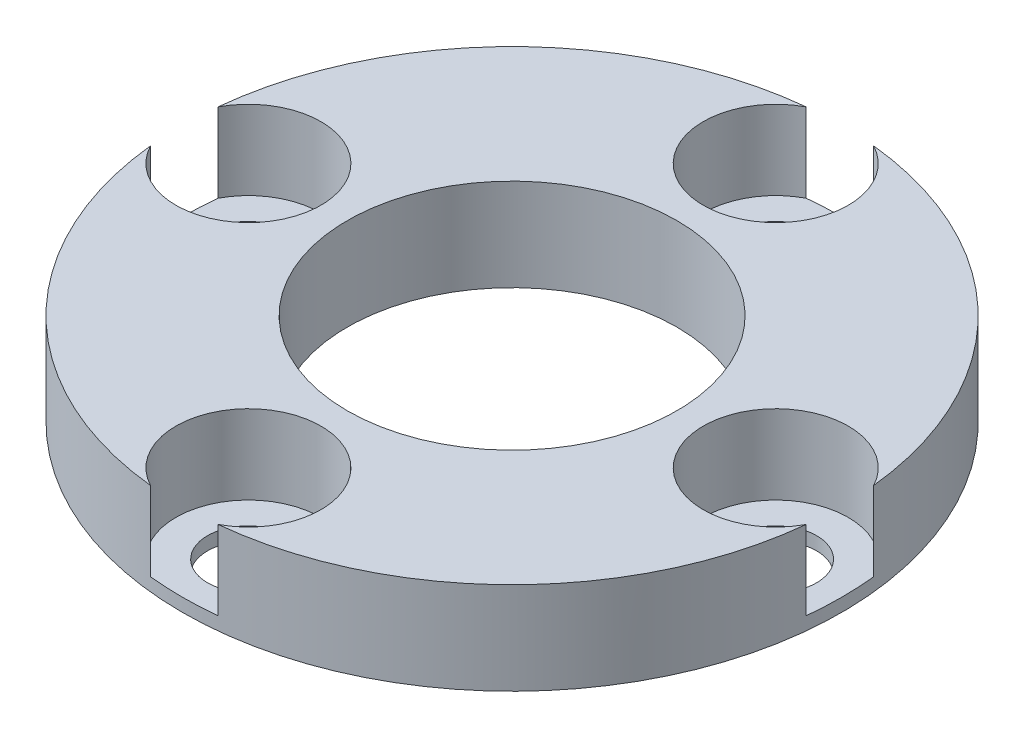
ISO-10303-21;
HEADER;
FILE_DESCRIPTION(('STEP AP214'),'2;1');
FILE_NAME('part.step','',(''),(''),'','','');
FILE_SCHEMA(('AUTOMOTIVE_DESIGN { 1 0 10303 214 1 1 1 1 }'));
ENDSEC;
DATA;
#1=APPLICATION_CONTEXT('core data for automotive mechanical design processes');
#2=APPLICATION_PROTOCOL_DEFINITION('international standard','automotive_design',2000,#1);
#3=PRODUCT_CONTEXT('',#1,'mechanical');
#4=PRODUCT('Part','Part','',(#3));
#5=PRODUCT_RELATED_PRODUCT_CATEGORY('part','',(#4));
#6=PRODUCT_DEFINITION_FORMATION('','',#4);
#7=PRODUCT_DEFINITION_CONTEXT('part definition',#1,'design');
#8=PRODUCT_DEFINITION('design','',#6,#7);
#9=PRODUCT_DEFINITION_SHAPE('','',#8);
#10=(LENGTH_UNIT() NAMED_UNIT(*) SI_UNIT(.MILLI.,.METRE.));
#11=(NAMED_UNIT(*) PLANE_ANGLE_UNIT() SI_UNIT($,.RADIAN.));
#12=(NAMED_UNIT(*) SI_UNIT($,.STERADIAN.) SOLID_ANGLE_UNIT());
#13=UNCERTAINTY_MEASURE_WITH_UNIT(LENGTH_MEASURE(1.E-05),#10,'distance_accuracy_value','');
#14=(GEOMETRIC_REPRESENTATION_CONTEXT(3) GLOBAL_UNCERTAINTY_ASSIGNED_CONTEXT((#13)) GLOBAL_UNIT_ASSIGNED_CONTEXT((#10,
#11,#12)) REPRESENTATION_CONTEXT('',''));
#15=CARTESIAN_POINT('',(0.,0.,0.));
#16=DIRECTION('',(0.,0.,1.));
#17=DIRECTION('',(1.,0.,0.));
#18=AXIS2_PLACEMENT_3D('',#15,#16,#17);
#19=CARTESIAN_POINT('',(-1.04744440165294E-13,-6.5,10.));
#20=DIRECTION('',(0.,1.,0.));
#21=DIRECTION('',(0.,0.,1.));
#22=AXIS2_PLACEMENT_3D('',#19,#20,#21);
#23=CYLINDRICAL_SURFACE('',#22,1.55);
#24=CARTESIAN_POINT('',(-1.04744440165294E-13,0.,10.));
#25=DIRECTION('',(0.,1.,0.));
#26=DIRECTION('',(0.,0.,1.));
#27=AXIS2_PLACEMENT_3D('',#24,#25,#26);
#28=CIRCLE('',#27,1.55);
#29=CARTESIAN_POINT('',(-1.04744440165294E-13,0.,11.55));
#30=VERTEX_POINT('',#29);
#31=EDGE_CURVE('E148',#30,#30,#28,.T.);
#32=ORIENTED_EDGE('',*,*,#31,.F.);
#33=EDGE_LOOP('',(#32));
#34=FACE_BOUND('',#33,.T.);
#35=CARTESIAN_POINT('',(-1.04744440165294E-13,0.5,10.));
#36=DIRECTION('',(0.,1.,0.));
#37=DIRECTION('',(0.,0.,1.));
#38=AXIS2_PLACEMENT_3D('',#35,#36,#37);
#39=CIRCLE('',#38,1.55);
#40=CARTESIAN_POINT('',(-1.04744440165294E-13,0.5,11.55));
#41=VERTEX_POINT('',#40);
#42=EDGE_CURVE('E179',#41,#41,#39,.F.);
#43=ORIENTED_EDGE('',*,*,#42,.F.);
#44=EDGE_LOOP('',(#43));
#45=FACE_BOUND('',#44,.T.);
#46=ADVANCED_FACE('F43',(#34,#45),#23,.F.);
#47=CARTESIAN_POINT('',(10.,-6.5,0.));
#48=DIRECTION('',(0.,1.,0.));
#49=DIRECTION('',(0.,0.,1.));
#50=AXIS2_PLACEMENT_3D('',#47,#48,#49);
#51=CYLINDRICAL_SURFACE('',#50,1.55);
#52=CARTESIAN_POINT('',(10.,0.,0.));
#53=DIRECTION('',(0.,1.,0.));
#54=DIRECTION('',(0.,0.,1.));
#55=AXIS2_PLACEMENT_3D('',#52,#53,#54);
#56=CIRCLE('',#55,1.55);
#57=CARTESIAN_POINT('',(10.,0.,1.55000000000007));
#58=VERTEX_POINT('',#57);
#59=EDGE_CURVE('E152',#58,#58,#56,.T.);
#60=ORIENTED_EDGE('',*,*,#59,.F.);
#61=EDGE_LOOP('',(#60));
#62=FACE_BOUND('',#61,.T.);
#63=CARTESIAN_POINT('',(10.,0.5,0.));
#64=DIRECTION('',(0.,1.,0.));
#65=DIRECTION('',(0.,0.,1.));
#66=AXIS2_PLACEMENT_3D('',#63,#64,#65);
#67=CIRCLE('',#66,1.55);
#68=CARTESIAN_POINT('',(10.,0.5,1.55000000000007));
#69=VERTEX_POINT('',#68);
#70=EDGE_CURVE('E174',#69,#69,#67,.F.);
#71=ORIENTED_EDGE('',*,*,#70,.F.);
#72=EDGE_LOOP('',(#71));
#73=FACE_BOUND('',#72,.T.);
#74=ADVANCED_FACE('F262',(#62,#73),#51,.F.);
#75=CARTESIAN_POINT('',(0.,-6.5,-10.));
#76=DIRECTION('',(0.,1.,0.));
#77=DIRECTION('',(0.,0.,1.));
#78=AXIS2_PLACEMENT_3D('',#75,#76,#77);
#79=CYLINDRICAL_SURFACE('',#78,1.55);
#80=CARTESIAN_POINT('',(0.,0.,-10.));
#81=DIRECTION('',(0.,1.,0.));
#82=DIRECTION('',(0.,0.,1.));
#83=AXIS2_PLACEMENT_3D('',#80,#81,#82);
#84=CIRCLE('',#83,1.55);
#85=CARTESIAN_POINT('',(0.,0.,-8.45));
#86=VERTEX_POINT('',#85);
#87=EDGE_CURVE('E157',#86,#86,#84,.T.);
#88=ORIENTED_EDGE('',*,*,#87,.F.);
#89=EDGE_LOOP('',(#88));
#90=FACE_BOUND('',#89,.T.);
#91=CARTESIAN_POINT('',(0.,0.5,-10.));
#92=DIRECTION('',(0.,1.,0.));
#93=DIRECTION('',(0.,0.,1.));
#94=AXIS2_PLACEMENT_3D('',#91,#92,#93);
#95=CIRCLE('',#94,1.55);
#96=CARTESIAN_POINT('',(0.,0.5,-8.45));
#97=VERTEX_POINT('',#96);
#98=EDGE_CURVE('E169',#97,#97,#95,.F.);
#99=ORIENTED_EDGE('',*,*,#98,.F.);
#100=EDGE_LOOP('',(#99));
#101=FACE_BOUND('',#100,.T.);
#102=ADVANCED_FACE('F267',(#90,#101),#79,.F.);
#103=CARTESIAN_POINT('',(-10.,-6.5,0.));
#104=DIRECTION('',(0.,1.,0.));
#105=DIRECTION('',(0.,0.,1.));
#106=AXIS2_PLACEMENT_3D('',#103,#104,#105);
#107=CYLINDRICAL_SURFACE('',#106,1.55);
#108=CARTESIAN_POINT('',(-10.,0.,0.));
#109=DIRECTION('',(0.,1.,0.));
#110=DIRECTION('',(0.,0.,1.));
#111=AXIS2_PLACEMENT_3D('',#108,#109,#110);
#112=CIRCLE('',#111,1.55);
#113=CARTESIAN_POINT('',(-10.,0.,1.55));
#114=VERTEX_POINT('',#113);
#115=EDGE_CURVE('E161',#114,#114,#112,.T.);
#116=ORIENTED_EDGE('',*,*,#115,.F.);
#117=EDGE_LOOP('',(#116));
#118=FACE_BOUND('',#117,.T.);
#119=CARTESIAN_POINT('',(-10.,0.5,0.));
#120=DIRECTION('',(0.,1.,0.));
#121=DIRECTION('',(0.,0.,1.));
#122=AXIS2_PLACEMENT_3D('',#119,#120,#121);
#123=CIRCLE('',#122,1.55);
#124=CARTESIAN_POINT('',(-10.,0.5,1.55));
#125=VERTEX_POINT('',#124);
#126=EDGE_CURVE('E165',#125,#125,#123,.F.);
#127=ORIENTED_EDGE('',*,*,#126,.F.);
#128=EDGE_LOOP('',(#127));
#129=FACE_BOUND('',#128,.T.);
#130=ADVANCED_FACE('F275',(#118,#129),#107,.F.);
#131=CARTESIAN_POINT('',(0.,3.5,0.));
#132=DIRECTION('',(0.,1.,0.));
#133=DIRECTION('',(0.,0.,1.));
#134=AXIS2_PLACEMENT_3D('',#131,#132,#133);
#135=PLANE('',#134);
#136=CARTESIAN_POINT('',(-10.,3.5,0.));
#137=DIRECTION('',(0.,1.,0.));
#138=DIRECTION('',(0.,0.,1.));
#139=AXIS2_PLACEMENT_3D('',#136,#137,#138);
#140=CIRCLE('',#139,2.75);
#141=CARTESIAN_POINT('',(-12.434375,3.5,1.27918660068615));
#142=VERTEX_POINT('',#141);
#143=CARTESIAN_POINT('',(-12.434375,3.5,-1.27918660068615));
#144=VERTEX_POINT('',#143);
#145=EDGE_CURVE('E108',#142,#144,#140,.T.);
#146=ORIENTED_EDGE('',*,*,#145,.F.);
#147=CARTESIAN_POINT('',(0.,3.5,0.));
#148=DIRECTION('',(0.,1.,0.));
#149=DIRECTION('',(0.,0.,1.));
#150=AXIS2_PLACEMENT_3D('',#147,#148,#149);
#151=CIRCLE('',#150,12.5);
#152=CARTESIAN_POINT('',(-1.27918660068628,3.5,12.434375));
#153=VERTEX_POINT('',#152);
#154=EDGE_CURVE('E131',#142,#153,#151,.T.);
#155=ORIENTED_EDGE('',*,*,#154,.T.);
#156=CARTESIAN_POINT('',(-1.04744440165294E-13,3.5,10.));
#157=DIRECTION('',(0.,1.,0.));
#158=DIRECTION('',(0.,0.,1.));
#159=AXIS2_PLACEMENT_3D('',#156,#157,#158);
#160=CIRCLE('',#159,2.75);
#161=CARTESIAN_POINT('',(1.27918660068602,3.5,12.434375));
#162=VERTEX_POINT('',#161);
#163=EDGE_CURVE('E208',#162,#153,#160,.T.);
#164=ORIENTED_EDGE('',*,*,#163,.F.);
#165=CARTESIAN_POINT('',(12.434375,3.5,1.27918660068624));
#166=VERTEX_POINT('',#165);
#167=EDGE_CURVE('E135',#162,#166,#151,.T.);
#168=ORIENTED_EDGE('',*,*,#167,.T.);
#169=CARTESIAN_POINT('',(10.,3.5,0.));
#170=DIRECTION('',(0.,1.,0.));
#171=DIRECTION('',(0.,0.,1.));
#172=AXIS2_PLACEMENT_3D('',#169,#170,#171);
#173=CIRCLE('',#172,2.75);
#174=CARTESIAN_POINT('',(12.434375,3.5,-1.27918660068606));
#175=VERTEX_POINT('',#174);
#176=EDGE_CURVE('E221',#175,#166,#173,.T.);
#177=ORIENTED_EDGE('',*,*,#176,.F.);
#178=CARTESIAN_POINT('',(1.27918660068619,3.5,-12.434375));
#179=VERTEX_POINT('',#178);
#180=EDGE_CURVE('E130',#175,#179,#151,.T.);
#181=ORIENTED_EDGE('',*,*,#180,.T.);
#182=CARTESIAN_POINT('',(0.,3.5,-10.));
#183=DIRECTION('',(0.,1.,0.));
#184=DIRECTION('',(0.,0.,1.));
#185=AXIS2_PLACEMENT_3D('',#182,#183,#184);
#186=CIRCLE('',#185,2.75);
#187=CARTESIAN_POINT('',(-1.27918660068611,3.5,-12.434375));
#188=VERTEX_POINT('',#187);
#189=EDGE_CURVE('E117',#188,#179,#186,.T.);
#190=ORIENTED_EDGE('',*,*,#189,.F.);
#191=EDGE_CURVE('E123',#188,#144,#151,.T.);
#192=ORIENTED_EDGE('',*,*,#191,.T.);
#193=EDGE_LOOP('',(#146,#155,#164,#168,#177,#181,#190,#192));
#194=FACE_BOUND('',#193,.T.);
#195=CARTESIAN_POINT('',(0.,3.5,0.));
#196=DIRECTION('',(0.,1.,0.));
#197=DIRECTION('',(0.,0.,1.));
#198=AXIS2_PLACEMENT_3D('',#195,#196,#197);
#199=CIRCLE('',#198,6.25);
#200=CARTESIAN_POINT('',(0.,3.5,6.25));
#201=VERTEX_POINT('',#200);
#202=EDGE_CURVE('E147',#201,#201,#199,.T.);
#203=ORIENTED_EDGE('',*,*,#202,.F.);
#204=EDGE_LOOP('',(#203));
#205=FACE_BOUND('',#204,.T.);
#206=ADVANCED_FACE('F126',(#194,#205),#135,.T.);
#207=CARTESIAN_POINT('',(0.,0.,0.));
#208=DIRECTION('',(0.,1.,0.));
#209=DIRECTION('',(0.,0.,1.));
#210=AXIS2_PLACEMENT_3D('',#207,#208,#209);
#211=PLANE('',#210);
#212=ORIENTED_EDGE('',*,*,#115,.T.);
#213=EDGE_LOOP('',(#212));
#214=FACE_BOUND('',#213,.T.);
#215=ORIENTED_EDGE('',*,*,#87,.T.);
#216=EDGE_LOOP('',(#215));
#217=FACE_BOUND('',#216,.T.);
#218=ORIENTED_EDGE('',*,*,#59,.T.);
#219=EDGE_LOOP('',(#218));
#220=FACE_BOUND('',#219,.T.);
#221=ORIENTED_EDGE('',*,*,#31,.T.);
#222=EDGE_LOOP('',(#221));
#223=FACE_BOUND('',#222,.T.);
#224=CARTESIAN_POINT('',(0.,0.,0.));
#225=DIRECTION('',(0.,1.,0.));
#226=DIRECTION('',(0.,0.,1.));
#227=AXIS2_PLACEMENT_3D('',#224,#225,#226);
#228=CIRCLE('',#227,12.5);
#229=CARTESIAN_POINT('',(0.,0.,12.5));
#230=VERTEX_POINT('',#229);
#231=EDGE_CURVE('E136',#230,#230,#228,.T.);
#232=ORIENTED_EDGE('',*,*,#231,.F.);
#233=EDGE_LOOP('',(#232));
#234=FACE_BOUND('',#233,.T.);
#235=CARTESIAN_POINT('',(0.,0.,0.));
#236=DIRECTION('',(0.,1.,0.));
#237=DIRECTION('',(0.,0.,1.));
#238=AXIS2_PLACEMENT_3D('',#235,#236,#237);
#239=CIRCLE('',#238,6.25);
#240=CARTESIAN_POINT('',(0.,0.,6.25));
#241=VERTEX_POINT('',#240);
#242=EDGE_CURVE('E142',#241,#241,#239,.T.);
#243=ORIENTED_EDGE('',*,*,#242,.T.);
#244=EDGE_LOOP('',(#243));
#245=FACE_BOUND('',#244,.T.);
#246=ADVANCED_FACE('F248',(#214,#217,#220,#223,#234,#245),#211,.F.);
#247=CARTESIAN_POINT('',(0.,3.5,0.));
#248=DIRECTION('',(0.,-1.,0.));
#249=DIRECTION('',(0.,0.,-1.));
#250=AXIS2_PLACEMENT_3D('',#247,#248,#249);
#251=CYLINDRICAL_SURFACE('',#250,12.5);
#252=CARTESIAN_POINT('',(0.,0.5,0.));
#253=DIRECTION('',(0.,1.,0.));
#254=DIRECTION('',(0.,0.,1.));
#255=AXIS2_PLACEMENT_3D('',#252,#253,#254);
#256=CIRCLE('',#255,12.5);
#257=CARTESIAN_POINT('',(-12.434375,0.5,-1.27918660068615));
#258=VERTEX_POINT('',#257);
#259=CARTESIAN_POINT('',(-12.434375,0.5,1.27918660068615));
#260=VERTEX_POINT('',#259);
#261=EDGE_CURVE('E124',#258,#260,#256,.T.);
#262=ORIENTED_EDGE('',*,*,#261,.F.);
#263=DIRECTION('',(0.,1.,0.));
#264=VECTOR('',#263,1.);
#265=CARTESIAN_POINT('',(-12.434375,2.,-1.27918660068616));
#266=LINE('',#265,#264);
#267=EDGE_CURVE('E11',#258,#144,#266,.T.);
#268=ORIENTED_EDGE('',*,*,#267,.T.);
#269=ORIENTED_EDGE('',*,*,#191,.F.);
#270=DIRECTION('',(0.,1.,0.));
#271=VECTOR('',#270,1.);
#272=CARTESIAN_POINT('',(-1.27918660068611,2.,-12.434375));
#273=LINE('',#272,#271);
#274=CARTESIAN_POINT('',(-1.27918660068611,0.5,-12.434375));
#275=VERTEX_POINT('',#274);
#276=EDGE_CURVE('E198',#188,#275,#273,.F.);
#277=ORIENTED_EDGE('',*,*,#276,.T.);
#278=CARTESIAN_POINT('',(0.,0.5,0.));
#279=DIRECTION('',(0.,1.,0.));
#280=DIRECTION('',(0.,0.,1.));
#281=AXIS2_PLACEMENT_3D('',#278,#279,#280);
#282=CIRCLE('',#281,12.5);
#283=CARTESIAN_POINT('',(1.27918660068619,0.5,-12.434375));
#284=VERTEX_POINT('',#283);
#285=EDGE_CURVE('E173',#284,#275,#282,.T.);
#286=ORIENTED_EDGE('',*,*,#285,.F.);
#287=DIRECTION('',(0.,1.,0.));
#288=VECTOR('',#287,1.);
#289=CARTESIAN_POINT('',(1.2791866006862,2.,-12.434375));
#290=LINE('',#289,#288);
#291=EDGE_CURVE('E201',#284,#179,#290,.T.);
#292=ORIENTED_EDGE('',*,*,#291,.T.);
#293=ORIENTED_EDGE('',*,*,#180,.F.);
#294=DIRECTION('',(0.,1.,0.));
#295=VECTOR('',#294,1.);
#296=CARTESIAN_POINT('',(12.434375,2.,-1.27918660068607));
#297=LINE('',#296,#295);
#298=CARTESIAN_POINT('',(12.434375,0.5,-1.27918660068606));
#299=VERTEX_POINT('',#298);
#300=EDGE_CURVE('E190',#175,#299,#297,.F.);
#301=ORIENTED_EDGE('',*,*,#300,.T.);
#302=CARTESIAN_POINT('',(0.,0.5,0.));
#303=DIRECTION('',(0.,1.,0.));
#304=DIRECTION('',(0.,0.,1.));
#305=AXIS2_PLACEMENT_3D('',#302,#303,#304);
#306=CIRCLE('',#305,12.5);
#307=CARTESIAN_POINT('',(12.434375,0.5,1.27918660068624));
#308=VERTEX_POINT('',#307);
#309=EDGE_CURVE('E178',#308,#299,#306,.T.);
#310=ORIENTED_EDGE('',*,*,#309,.F.);
#311=DIRECTION('',(0.,1.,0.));
#312=VECTOR('',#311,1.);
#313=CARTESIAN_POINT('',(12.434375,2.,1.27918660068624));
#314=LINE('',#313,#312);
#315=EDGE_CURVE('E194',#308,#166,#314,.T.);
#316=ORIENTED_EDGE('',*,*,#315,.T.);
#317=ORIENTED_EDGE('',*,*,#167,.F.);
#318=DIRECTION('',(0.,1.,0.));
#319=VECTOR('',#318,1.);
#320=CARTESIAN_POINT('',(1.27918660068603,2.,12.434375));
#321=LINE('',#320,#319);
#322=CARTESIAN_POINT('',(1.27918660068602,0.5,12.434375));
#323=VERTEX_POINT('',#322);
#324=EDGE_CURVE('E141',#162,#323,#321,.F.);
#325=ORIENTED_EDGE('',*,*,#324,.T.);
#326=CARTESIAN_POINT('',(0.,0.5,0.));
#327=DIRECTION('',(0.,1.,0.));
#328=DIRECTION('',(0.,0.,1.));
#329=AXIS2_PLACEMENT_3D('',#326,#327,#328);
#330=CIRCLE('',#329,12.5);
#331=CARTESIAN_POINT('',(-1.27918660068628,0.5,12.434375));
#332=VERTEX_POINT('',#331);
#333=EDGE_CURVE('E153',#332,#323,#330,.T.);
#334=ORIENTED_EDGE('',*,*,#333,.F.);
#335=DIRECTION('',(0.,1.,0.));
#336=VECTOR('',#335,1.);
#337=CARTESIAN_POINT('',(-1.27918660068629,2.,12.434375));
#338=LINE('',#337,#336);
#339=EDGE_CURVE('E186',#332,#153,#338,.T.);
#340=ORIENTED_EDGE('',*,*,#339,.T.);
#341=ORIENTED_EDGE('',*,*,#154,.F.);
#342=DIRECTION('',(0.,1.,0.));
#343=VECTOR('',#342,1.);
#344=CARTESIAN_POINT('',(-12.434375,2.,1.27918660068616));
#345=LINE('',#344,#343);
#346=EDGE_CURVE('E52',#142,#260,#345,.F.);
#347=ORIENTED_EDGE('',*,*,#346,.T.);
#348=EDGE_LOOP('',(#262,#268,#269,#277,#286,#292,#293,#301,#310,#316,#317,#325,#334,#340,#341,#347));
#349=FACE_BOUND('',#348,.T.);
#350=ORIENTED_EDGE('',*,*,#231,.T.);
#351=EDGE_LOOP('',(#350));
#352=FACE_BOUND('',#351,.T.);
#353=ADVANCED_FACE('F45',(#349,#352),#251,.T.);
#354=CARTESIAN_POINT('',(0.,3.5,0.));
#355=DIRECTION('',(0.,-1.,0.));
#356=DIRECTION('',(0.,0.,-1.));
#357=AXIS2_PLACEMENT_3D('',#354,#355,#356);
#358=CYLINDRICAL_SURFACE('',#357,6.25);
#359=ORIENTED_EDGE('',*,*,#202,.T.);
#360=EDGE_LOOP('',(#359));
#361=FACE_BOUND('',#360,.T.);
#362=ORIENTED_EDGE('',*,*,#242,.F.);
#363=EDGE_LOOP('',(#362));
#364=FACE_BOUND('',#363,.T.);
#365=ADVANCED_FACE('F250',(#361,#364),#358,.F.);
#366=CARTESIAN_POINT('',(-10.,0.5,0.));
#367=DIRECTION('',(0.,1.,0.));
#368=DIRECTION('',(0.,0.,1.));
#369=AXIS2_PLACEMENT_3D('',#366,#367,#368);
#370=CYLINDRICAL_SURFACE('',#369,2.75);
#371=CARTESIAN_POINT('',(-10.,0.5,0.));
#372=DIRECTION('',(0.,1.,0.));
#373=DIRECTION('',(0.,0.,1.));
#374=AXIS2_PLACEMENT_3D('',#371,#372,#373);
#375=CIRCLE('',#374,2.75);
#376=EDGE_CURVE('E58',#260,#258,#375,.T.);
#377=ORIENTED_EDGE('',*,*,#376,.F.);
#378=ORIENTED_EDGE('',*,*,#346,.F.);
#379=ORIENTED_EDGE('',*,*,#145,.T.);
#380=ORIENTED_EDGE('',*,*,#267,.F.);
#381=EDGE_LOOP('',(#377,#378,#379,#380));
#382=FACE_BOUND('',#381,.T.);
#383=ADVANCED_FACE('F109',(#382),#370,.F.);
#384=CARTESIAN_POINT('',(-10.,0.5,0.));
#385=DIRECTION('',(0.,1.,0.));
#386=DIRECTION('',(0.,0.,1.));
#387=AXIS2_PLACEMENT_3D('',#384,#385,#386);
#388=PLANE('',#387);
#389=ORIENTED_EDGE('',*,*,#126,.T.);
#390=EDGE_LOOP('',(#389));
#391=FACE_BOUND('',#390,.T.);
#392=ORIENTED_EDGE('',*,*,#261,.T.);
#393=ORIENTED_EDGE('',*,*,#376,.T.);
#394=EDGE_LOOP('',(#392,#393));
#395=FACE_BOUND('',#394,.T.);
#396=ADVANCED_FACE('F257',(#391,#395),#388,.T.);
#397=CARTESIAN_POINT('',(0.,0.5,-10.));
#398=DIRECTION('',(0.,1.,0.));
#399=DIRECTION('',(0.,0.,1.));
#400=AXIS2_PLACEMENT_3D('',#397,#398,#399);
#401=CYLINDRICAL_SURFACE('',#400,2.75);
#402=CARTESIAN_POINT('',(0.,0.5,-10.));
#403=DIRECTION('',(0.,1.,0.));
#404=DIRECTION('',(0.,0.,1.));
#405=AXIS2_PLACEMENT_3D('',#402,#403,#404);
#406=CIRCLE('',#405,2.75);
#407=EDGE_CURVE('E65',#275,#284,#406,.T.);
#408=ORIENTED_EDGE('',*,*,#407,.F.);
#409=ORIENTED_EDGE('',*,*,#276,.F.);
#410=ORIENTED_EDGE('',*,*,#189,.T.);
#411=ORIENTED_EDGE('',*,*,#291,.F.);
#412=EDGE_LOOP('',(#408,#409,#410,#411));
#413=FACE_BOUND('',#412,.T.);
#414=ADVANCED_FACE('F296',(#413),#401,.F.);
#415=CARTESIAN_POINT('',(0.,0.5,-10.));
#416=DIRECTION('',(0.,1.,0.));
#417=DIRECTION('',(0.,0.,1.));
#418=AXIS2_PLACEMENT_3D('',#415,#416,#417);
#419=PLANE('',#418);
#420=ORIENTED_EDGE('',*,*,#98,.T.);
#421=EDGE_LOOP('',(#420));
#422=FACE_BOUND('',#421,.T.);
#423=ORIENTED_EDGE('',*,*,#285,.T.);
#424=ORIENTED_EDGE('',*,*,#407,.T.);
#425=EDGE_LOOP('',(#423,#424));
#426=FACE_BOUND('',#425,.T.);
#427=ADVANCED_FACE('F293',(#422,#426),#419,.T.);
#428=CARTESIAN_POINT('',(10.,0.5,0.));
#429=DIRECTION('',(0.,1.,0.));
#430=DIRECTION('',(0.,0.,1.));
#431=AXIS2_PLACEMENT_3D('',#428,#429,#430);
#432=CYLINDRICAL_SURFACE('',#431,2.75);
#433=CARTESIAN_POINT('',(10.,0.5,0.));
#434=DIRECTION('',(0.,1.,0.));
#435=DIRECTION('',(0.,0.,1.));
#436=AXIS2_PLACEMENT_3D('',#433,#434,#435);
#437=CIRCLE('',#436,2.75);
#438=EDGE_CURVE('E213',#299,#308,#437,.T.);
#439=ORIENTED_EDGE('',*,*,#438,.F.);
#440=ORIENTED_EDGE('',*,*,#300,.F.);
#441=ORIENTED_EDGE('',*,*,#176,.T.);
#442=ORIENTED_EDGE('',*,*,#315,.F.);
#443=EDGE_LOOP('',(#439,#440,#441,#442));
#444=FACE_BOUND('',#443,.T.);
#445=ADVANCED_FACE('F220',(#444),#432,.F.);
#446=CARTESIAN_POINT('',(10.,0.5,0.));
#447=DIRECTION('',(0.,1.,0.));
#448=DIRECTION('',(0.,0.,1.));
#449=AXIS2_PLACEMENT_3D('',#446,#447,#448);
#450=PLANE('',#449);
#451=ORIENTED_EDGE('',*,*,#70,.T.);
#452=EDGE_LOOP('',(#451));
#453=FACE_BOUND('',#452,.T.);
#454=ORIENTED_EDGE('',*,*,#309,.T.);
#455=ORIENTED_EDGE('',*,*,#438,.T.);
#456=EDGE_LOOP('',(#454,#455));
#457=FACE_BOUND('',#456,.T.);
#458=ADVANCED_FACE('F287',(#453,#457),#450,.T.);
#459=CARTESIAN_POINT('',(-1.04744440165294E-13,0.5,10.));
#460=DIRECTION('',(0.,1.,0.));
#461=DIRECTION('',(0.,0.,1.));
#462=AXIS2_PLACEMENT_3D('',#459,#460,#461);
#463=CYLINDRICAL_SURFACE('',#462,2.75);
#464=CARTESIAN_POINT('',(-1.04744440165294E-13,0.5,10.));
#465=DIRECTION('',(0.,1.,0.));
#466=DIRECTION('',(0.,0.,1.));
#467=AXIS2_PLACEMENT_3D('',#464,#465,#466);
#468=CIRCLE('',#467,2.75);
#469=EDGE_CURVE('E214',#323,#332,#468,.T.);
#470=ORIENTED_EDGE('',*,*,#469,.F.);
#471=ORIENTED_EDGE('',*,*,#324,.F.);
#472=ORIENTED_EDGE('',*,*,#163,.T.);
#473=ORIENTED_EDGE('',*,*,#339,.F.);
#474=EDGE_LOOP('',(#470,#471,#472,#473));
#475=FACE_BOUND('',#474,.T.);
#476=ADVANCED_FACE('F283',(#475),#463,.F.);
#477=CARTESIAN_POINT('',(-1.04744440165294E-13,0.5,10.));
#478=DIRECTION('',(0.,1.,0.));
#479=DIRECTION('',(0.,0.,1.));
#480=AXIS2_PLACEMENT_3D('',#477,#478,#479);
#481=PLANE('',#480);
#482=ORIENTED_EDGE('',*,*,#42,.T.);
#483=EDGE_LOOP('',(#482));
#484=FACE_BOUND('',#483,.T.);
#485=ORIENTED_EDGE('',*,*,#333,.T.);
#486=ORIENTED_EDGE('',*,*,#469,.T.);
#487=EDGE_LOOP('',(#485,#486));
#488=FACE_BOUND('',#487,.T.);
#489=ADVANCED_FACE('F280',(#484,#488),#481,.T.);
#490=CLOSED_SHELL('',(#46,#74,#102,#130,#206,#246,#353,#365,#383,#396,#414,#427,#445,#458,#476,#489));
#491=MANIFOLD_SOLID_BREP('B2',#490);
#492=ADVANCED_BREP_SHAPE_REPRESENTATION('',(#18,#491),#14);
#493=SHAPE_DEFINITION_REPRESENTATION(#9,#492);
ENDSEC;
END-ISO-10303-21;
